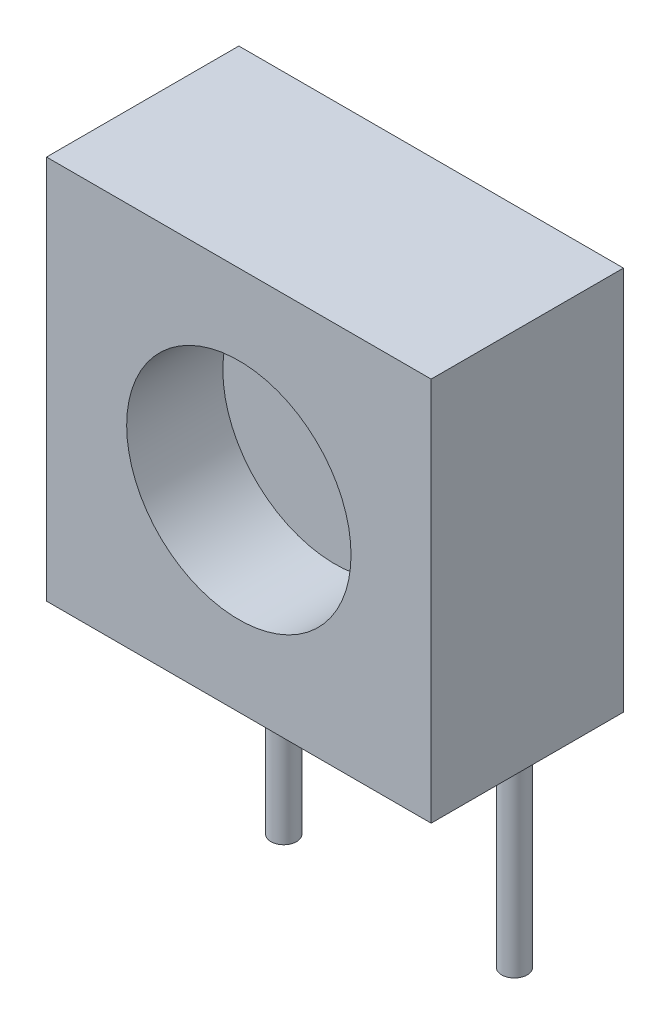
ISO-10303-21;
HEADER;
FILE_DESCRIPTION(('STEP AP214'),'2;1');
FILE_NAME('part.step','',(''),(''),'','','');
FILE_SCHEMA(('AUTOMOTIVE_DESIGN { 1 0 10303 214 1 1 1 1 }'));
ENDSEC;
DATA;
#1=APPLICATION_CONTEXT('core data for automotive mechanical design processes');
#2=APPLICATION_PROTOCOL_DEFINITION('international standard','automotive_design',2000,#1);
#3=PRODUCT_CONTEXT('',#1,'mechanical');
#4=PRODUCT('Part','Part','',(#3));
#5=PRODUCT_RELATED_PRODUCT_CATEGORY('part','',(#4));
#6=PRODUCT_DEFINITION_FORMATION('','',#4);
#7=PRODUCT_DEFINITION_CONTEXT('part definition',#1,'design');
#8=PRODUCT_DEFINITION('design','',#6,#7);
#9=PRODUCT_DEFINITION_SHAPE('','',#8);
#10=(LENGTH_UNIT() NAMED_UNIT(*) SI_UNIT(.MILLI.,.METRE.));
#11=(NAMED_UNIT(*) PLANE_ANGLE_UNIT() SI_UNIT($,.RADIAN.));
#12=(NAMED_UNIT(*) SI_UNIT($,.STERADIAN.) SOLID_ANGLE_UNIT());
#13=UNCERTAINTY_MEASURE_WITH_UNIT(LENGTH_MEASURE(1.E-05),#10,'distance_accuracy_value','');
#14=(GEOMETRIC_REPRESENTATION_CONTEXT(3) GLOBAL_UNCERTAINTY_ASSIGNED_CONTEXT((#13)) GLOBAL_UNIT_ASSIGNED_CONTEXT((#10,
#11,#12)) REPRESENTATION_CONTEXT('',''));
#15=CARTESIAN_POINT('',(0.,0.,0.));
#16=DIRECTION('',(0.,0.,1.));
#17=DIRECTION('',(1.,0.,0.));
#18=AXIS2_PLACEMENT_3D('',#15,#16,#17);
#19=CARTESIAN_POINT('',(3.,3.,3.));
#20=DIRECTION('',(0.,0.,-1.));
#21=DIRECTION('',(-1.,0.,0.));
#22=AXIS2_PLACEMENT_3D('',#19,#20,#21);
#23=CYLINDRICAL_SURFACE('',#22,1.75);
#24=CARTESIAN_POINT('',(3.,3.,3.));
#25=DIRECTION('',(0.,0.,1.));
#26=DIRECTION('',(1.,0.,0.));
#27=AXIS2_PLACEMENT_3D('',#24,#25,#26);
#28=CIRCLE('',#27,1.75);
#29=CARTESIAN_POINT('',(4.75,3.,3.));
#30=VERTEX_POINT('',#29);
#31=EDGE_CURVE('E117',#30,#30,#28,.T.);
#32=ORIENTED_EDGE('',*,*,#31,.T.);
#33=EDGE_LOOP('',(#32));
#34=FACE_BOUND('',#33,.T.);
#35=CARTESIAN_POINT('',(3.,3.,1.5));
#36=DIRECTION('',(0.,0.,-1.));
#37=DIRECTION('',(-1.,0.,0.));
#38=AXIS2_PLACEMENT_3D('',#35,#36,#37);
#39=CIRCLE('',#38,1.75);
#40=CARTESIAN_POINT('',(1.25,3.,1.5));
#41=VERTEX_POINT('',#40);
#42=EDGE_CURVE('E132',#41,#41,#39,.T.);
#43=ORIENTED_EDGE('',*,*,#42,.T.);
#44=EDGE_LOOP('',(#43));
#45=FACE_BOUND('',#44,.T.);
#46=ADVANCED_FACE('F41',(#34,#45),#23,.F.);
#47=CARTESIAN_POINT('',(0.,0.,3.));
#48=DIRECTION('',(0.,0.,-1.));
#49=DIRECTION('',(-1.,0.,0.));
#50=AXIS2_PLACEMENT_3D('',#47,#48,#49);
#51=PLANE('',#50);
#52=DIRECTION('',(0.,-1.,0.));
#53=VECTOR('',#52,1.);
#54=CARTESIAN_POINT('',(0.,0.,3.));
#55=LINE('',#54,#53);
#56=CARTESIAN_POINT('',(0.,6.,3.));
#57=VERTEX_POINT('',#56);
#58=CARTESIAN_POINT('',(0.,0.,3.));
#59=VERTEX_POINT('',#58);
#60=EDGE_CURVE('E93',#57,#59,#55,.T.);
#61=ORIENTED_EDGE('',*,*,#60,.T.);
#62=DIRECTION('',(1.,0.,0.));
#63=VECTOR('',#62,1.);
#64=CARTESIAN_POINT('',(0.,0.,3.));
#65=LINE('',#64,#63);
#66=CARTESIAN_POINT('',(6.,0.,3.));
#67=VERTEX_POINT('',#66);
#68=EDGE_CURVE('E88',#59,#67,#65,.T.);
#69=ORIENTED_EDGE('',*,*,#68,.T.);
#70=DIRECTION('',(0.,1.,0.));
#71=VECTOR('',#70,1.);
#72=CARTESIAN_POINT('',(6.,0.,3.));
#73=LINE('',#72,#71);
#74=CARTESIAN_POINT('',(6.,6.,3.));
#75=VERTEX_POINT('',#74);
#76=EDGE_CURVE('E92',#67,#75,#73,.T.);
#77=ORIENTED_EDGE('',*,*,#76,.T.);
#78=DIRECTION('',(-1.,0.,0.));
#79=VECTOR('',#78,1.);
#80=CARTESIAN_POINT('',(0.,6.,3.));
#81=LINE('',#80,#79);
#82=EDGE_CURVE('E59',#75,#57,#81,.T.);
#83=ORIENTED_EDGE('',*,*,#82,.T.);
#84=EDGE_LOOP('',(#61,#69,#77,#83));
#85=FACE_BOUND('',#84,.T.);
#86=ORIENTED_EDGE('',*,*,#31,.F.);
#87=EDGE_LOOP('',(#86));
#88=FACE_BOUND('',#87,.T.);
#89=ADVANCED_FACE('F89',(#85,#88),#51,.F.);
#90=CARTESIAN_POINT('',(0.,0.,0.));
#91=DIRECTION('',(0.,0.,-1.));
#92=DIRECTION('',(-1.,0.,0.));
#93=AXIS2_PLACEMENT_3D('',#90,#91,#92);
#94=PLANE('',#93);
#95=DIRECTION('',(0.,-1.,0.));
#96=VECTOR('',#95,1.);
#97=CARTESIAN_POINT('',(0.,0.,0.));
#98=LINE('',#97,#96);
#99=CARTESIAN_POINT('',(0.,6.,0.));
#100=VERTEX_POINT('',#99);
#101=CARTESIAN_POINT('',(0.,0.,0.));
#102=VERTEX_POINT('',#101);
#103=EDGE_CURVE('E114',#100,#102,#98,.T.);
#104=ORIENTED_EDGE('',*,*,#103,.F.);
#105=DIRECTION('',(-1.,0.,0.));
#106=VECTOR('',#105,1.);
#107=CARTESIAN_POINT('',(0.,6.,0.));
#108=LINE('',#107,#106);
#109=CARTESIAN_POINT('',(6.,6.,0.));
#110=VERTEX_POINT('',#109);
#111=EDGE_CURVE('E123',#110,#100,#108,.T.);
#112=ORIENTED_EDGE('',*,*,#111,.F.);
#113=DIRECTION('',(0.,1.,0.));
#114=VECTOR('',#113,1.);
#115=CARTESIAN_POINT('',(6.,0.,0.));
#116=LINE('',#115,#114);
#117=CARTESIAN_POINT('',(6.,0.,0.));
#118=VERTEX_POINT('',#117);
#119=EDGE_CURVE('E120',#118,#110,#116,.T.);
#120=ORIENTED_EDGE('',*,*,#119,.F.);
#121=DIRECTION('',(1.,0.,0.));
#122=VECTOR('',#121,1.);
#123=CARTESIAN_POINT('',(0.,0.,0.));
#124=LINE('',#123,#122);
#125=EDGE_CURVE('E101',#102,#118,#124,.T.);
#126=ORIENTED_EDGE('',*,*,#125,.F.);
#127=EDGE_LOOP('',(#104,#112,#120,#126));
#128=FACE_BOUND('',#127,.T.);
#129=ADVANCED_FACE('F150',(#128),#94,.T.);
#130=CARTESIAN_POINT('',(0.,0.,3.));
#131=DIRECTION('',(1.,0.,0.));
#132=DIRECTION('',(0.,0.,-1.));
#133=AXIS2_PLACEMENT_3D('',#130,#131,#132);
#134=PLANE('',#133);
#135=ORIENTED_EDGE('',*,*,#103,.T.);
#136=DIRECTION('',(0.,0.,-1.));
#137=VECTOR('',#136,1.);
#138=CARTESIAN_POINT('',(0.,0.,3.));
#139=LINE('',#138,#137);
#140=EDGE_CURVE('E105',#59,#102,#139,.T.);
#141=ORIENTED_EDGE('',*,*,#140,.F.);
#142=ORIENTED_EDGE('',*,*,#60,.F.);
#143=DIRECTION('',(0.,0.,-1.));
#144=VECTOR('',#143,1.);
#145=CARTESIAN_POINT('',(0.,6.,3.));
#146=LINE('',#145,#144);
#147=EDGE_CURVE('E82',#57,#100,#146,.T.);
#148=ORIENTED_EDGE('',*,*,#147,.T.);
#149=EDGE_LOOP('',(#135,#141,#142,#148));
#150=FACE_BOUND('',#149,.T.);
#151=ADVANCED_FACE('F43',(#150),#134,.F.);
#152=CARTESIAN_POINT('',(0.,0.,3.));
#153=DIRECTION('',(0.,1.,0.));
#154=DIRECTION('',(0.,0.,1.));
#155=AXIS2_PLACEMENT_3D('',#152,#153,#154);
#156=PLANE('',#155);
#157=CARTESIAN_POINT('',(4.8,0.,0.5));
#158=DIRECTION('',(0.,1.,0.));
#159=DIRECTION('',(0.,0.,1.));
#160=AXIS2_PLACEMENT_3D('',#157,#158,#159);
#161=CIRCLE('',#160,0.2);
#162=CARTESIAN_POINT('',(4.8,0.,0.7));
#163=VERTEX_POINT('',#162);
#164=EDGE_CURVE('E12',#163,#163,#161,.F.);
#165=ORIENTED_EDGE('',*,*,#164,.F.);
#166=EDGE_LOOP('',(#165));
#167=FACE_BOUND('',#166,.T.);
#168=CARTESIAN_POINT('',(1.2,0.,0.5));
#169=DIRECTION('',(0.,1.,0.));
#170=DIRECTION('',(0.,0.,1.));
#171=AXIS2_PLACEMENT_3D('',#168,#169,#170);
#172=CIRCLE('',#171,0.2);
#173=CARTESIAN_POINT('',(1.2,0.,0.7));
#174=VERTEX_POINT('',#173);
#175=EDGE_CURVE('E51',#174,#174,#172,.F.);
#176=ORIENTED_EDGE('',*,*,#175,.F.);
#177=EDGE_LOOP('',(#176));
#178=FACE_BOUND('',#177,.T.);
#179=ORIENTED_EDGE('',*,*,#125,.T.);
#180=DIRECTION('',(0.,0.,-1.));
#181=VECTOR('',#180,1.);
#182=CARTESIAN_POINT('',(6.,0.,3.));
#183=LINE('',#182,#181);
#184=EDGE_CURVE('E98',#67,#118,#183,.T.);
#185=ORIENTED_EDGE('',*,*,#184,.F.);
#186=ORIENTED_EDGE('',*,*,#68,.F.);
#187=ORIENTED_EDGE('',*,*,#140,.T.);
#188=EDGE_LOOP('',(#179,#185,#186,#187));
#189=FACE_BOUND('',#188,.T.);
#190=ADVANCED_FACE('F99',(#167,#178,#189),#156,.F.);
#191=CARTESIAN_POINT('',(6.,0.,3.));
#192=DIRECTION('',(-1.,0.,0.));
#193=DIRECTION('',(0.,0.,1.));
#194=AXIS2_PLACEMENT_3D('',#191,#192,#193);
#195=PLANE('',#194);
#196=ORIENTED_EDGE('',*,*,#119,.T.);
#197=DIRECTION('',(0.,0.,-1.));
#198=VECTOR('',#197,1.);
#199=CARTESIAN_POINT('',(6.,6.,3.));
#200=LINE('',#199,#198);
#201=EDGE_CURVE('E75',#75,#110,#200,.T.);
#202=ORIENTED_EDGE('',*,*,#201,.F.);
#203=ORIENTED_EDGE('',*,*,#76,.F.);
#204=ORIENTED_EDGE('',*,*,#184,.T.);
#205=EDGE_LOOP('',(#196,#202,#203,#204));
#206=FACE_BOUND('',#205,.T.);
#207=ADVANCED_FACE('F107',(#206),#195,.F.);
#208=CARTESIAN_POINT('',(0.,6.,3.));
#209=DIRECTION('',(0.,-1.,0.));
#210=DIRECTION('',(0.,0.,-1.));
#211=AXIS2_PLACEMENT_3D('',#208,#209,#210);
#212=PLANE('',#211);
#213=ORIENTED_EDGE('',*,*,#111,.T.);
#214=ORIENTED_EDGE('',*,*,#147,.F.);
#215=ORIENTED_EDGE('',*,*,#82,.F.);
#216=ORIENTED_EDGE('',*,*,#201,.T.);
#217=EDGE_LOOP('',(#213,#214,#215,#216));
#218=FACE_BOUND('',#217,.T.);
#219=ADVANCED_FACE('F148',(#218),#212,.F.);
#220=CARTESIAN_POINT('',(0.,0.,1.5));
#221=DIRECTION('',(0.,0.,-1.));
#222=DIRECTION('',(-1.,0.,0.));
#223=AXIS2_PLACEMENT_3D('',#220,#221,#222);
#224=PLANE('',#223);
#225=ORIENTED_EDGE('',*,*,#42,.F.);
#226=EDGE_LOOP('',(#225));
#227=FACE_BOUND('',#226,.T.);
#228=ADVANCED_FACE('F162',(#227),#224,.F.);
#229=CARTESIAN_POINT('',(1.2,-3.8,0.5));
#230=DIRECTION('',(0.,1.,0.));
#231=DIRECTION('',(0.,0.,1.));
#232=AXIS2_PLACEMENT_3D('',#229,#230,#231);
#233=CYLINDRICAL_SURFACE('',#232,0.2);
#234=CARTESIAN_POINT('',(1.2,-3.8,0.5));
#235=DIRECTION('',(0.,-1.,0.));
#236=DIRECTION('',(0.,0.,-1.));
#237=AXIS2_PLACEMENT_3D('',#234,#235,#236);
#238=CIRCLE('',#237,0.2);
#239=CARTESIAN_POINT('',(1.2,-3.8,0.3));
#240=VERTEX_POINT('',#239);
#241=EDGE_CURVE('E135',#240,#240,#238,.T.);
#242=ORIENTED_EDGE('',*,*,#241,.F.);
#243=EDGE_LOOP('',(#242));
#244=FACE_BOUND('',#243,.T.);
#245=ORIENTED_EDGE('',*,*,#175,.T.);
#246=EDGE_LOOP('',(#245));
#247=FACE_BOUND('',#246,.T.);
#248=ADVANCED_FACE('F140',(#244,#247),#233,.T.);
#249=CARTESIAN_POINT('',(1.2,-3.8,0.5));
#250=DIRECTION('',(0.,-1.,0.));
#251=DIRECTION('',(0.,0.,-1.));
#252=AXIS2_PLACEMENT_3D('',#249,#250,#251);
#253=PLANE('',#252);
#254=ORIENTED_EDGE('',*,*,#241,.T.);
#255=EDGE_LOOP('',(#254));
#256=FACE_BOUND('',#255,.T.);
#257=ADVANCED_FACE('F192',(#256),#253,.T.);
#258=CARTESIAN_POINT('',(4.8,-3.8,0.5));
#259=DIRECTION('',(0.,1.,0.));
#260=DIRECTION('',(0.,0.,1.));
#261=AXIS2_PLACEMENT_3D('',#258,#259,#260);
#262=CYLINDRICAL_SURFACE('',#261,0.2);
#263=CARTESIAN_POINT('',(4.8,-3.8,0.5));
#264=DIRECTION('',(0.,-1.,0.));
#265=DIRECTION('',(0.,0.,-1.));
#266=AXIS2_PLACEMENT_3D('',#263,#264,#265);
#267=CIRCLE('',#266,0.2);
#268=CARTESIAN_POINT('',(4.8,-3.8,0.3));
#269=VERTEX_POINT('',#268);
#270=EDGE_CURVE('E182',#269,#269,#267,.T.);
#271=ORIENTED_EDGE('',*,*,#270,.F.);
#272=EDGE_LOOP('',(#271));
#273=FACE_BOUND('',#272,.T.);
#274=ORIENTED_EDGE('',*,*,#164,.T.);
#275=EDGE_LOOP('',(#274));
#276=FACE_BOUND('',#275,.T.);
#277=ADVANCED_FACE('F189',(#273,#276),#262,.T.);
#278=CARTESIAN_POINT('',(4.8,-3.8,0.5));
#279=DIRECTION('',(0.,-1.,0.));
#280=DIRECTION('',(0.,0.,-1.));
#281=AXIS2_PLACEMENT_3D('',#278,#279,#280);
#282=PLANE('',#281);
#283=ORIENTED_EDGE('',*,*,#270,.T.);
#284=EDGE_LOOP('',(#283));
#285=FACE_BOUND('',#284,.T.);
#286=ADVANCED_FACE('F187',(#285),#282,.T.);
#287=CLOSED_SHELL('',(#46,#89,#129,#151,#190,#207,#219,#228,#248,#257,#277,#286));
#288=MANIFOLD_SOLID_BREP('B2',#287);
#289=ADVANCED_BREP_SHAPE_REPRESENTATION('',(#18,#288),#14);
#290=SHAPE_DEFINITION_REPRESENTATION(#9,#289);
ENDSEC;
END-ISO-10303-21;
